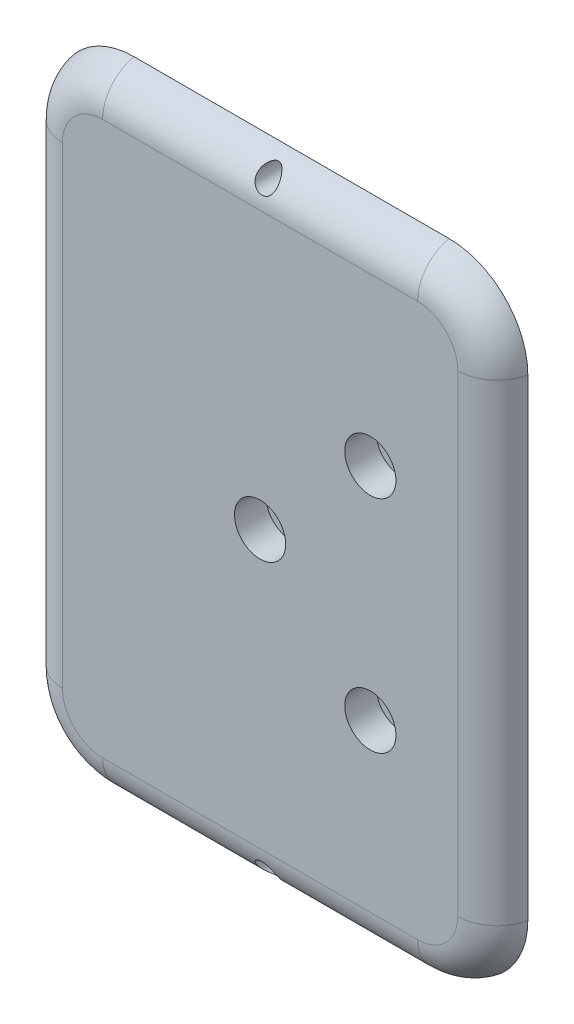
ISO-10303-21;
HEADER;
FILE_DESCRIPTION(('STEP AP214'),'2;1');
FILE_NAME('part.step','',(''),(''),'','','');
FILE_SCHEMA(('AUTOMOTIVE_DESIGN { 1 0 10303 214 1 1 1 1 }'));
ENDSEC;
DATA;
#1=APPLICATION_CONTEXT('core data for automotive mechanical design processes');
#2=APPLICATION_PROTOCOL_DEFINITION('international standard','automotive_design',2000,#1);
#3=PRODUCT_CONTEXT('',#1,'mechanical');
#4=PRODUCT('Part','Part','',(#3));
#5=PRODUCT_RELATED_PRODUCT_CATEGORY('part','',(#4));
#6=PRODUCT_DEFINITION_FORMATION('','',#4);
#7=PRODUCT_DEFINITION_CONTEXT('part definition',#1,'design');
#8=PRODUCT_DEFINITION('design','',#6,#7);
#9=PRODUCT_DEFINITION_SHAPE('','',#8);
#10=(LENGTH_UNIT() NAMED_UNIT(*) SI_UNIT(.MILLI.,.METRE.));
#11=(NAMED_UNIT(*) PLANE_ANGLE_UNIT() SI_UNIT($,.RADIAN.));
#12=(NAMED_UNIT(*) SI_UNIT($,.STERADIAN.) SOLID_ANGLE_UNIT());
#13=UNCERTAINTY_MEASURE_WITH_UNIT(LENGTH_MEASURE(1.E-05),#10,'distance_accuracy_value','');
#14=(GEOMETRIC_REPRESENTATION_CONTEXT(3) GLOBAL_UNCERTAINTY_ASSIGNED_CONTEXT((#13)) GLOBAL_UNIT_ASSIGNED_CONTEXT((#10,
#11,#12)) REPRESENTATION_CONTEXT('',''));
#15=CARTESIAN_POINT('',(0.,0.,0.));
#16=DIRECTION('',(0.,0.,1.));
#17=DIRECTION('',(1.,0.,0.));
#18=AXIS2_PLACEMENT_3D('',#15,#16,#17);
#19=CARTESIAN_POINT('',(20.,-30.,3.));
#20=DIRECTION('',(0.,0.,-1.));
#21=DIRECTION('',(-1.,0.,0.));
#22=AXIS2_PLACEMENT_3D('',#19,#20,#21);
#23=CYLINDRICAL_SURFACE('',#22,5.7);
#24=CARTESIAN_POINT('',(20.,-30.,0.));
#25=DIRECTION('',(0.,0.,1.));
#26=DIRECTION('',(1.,0.,0.));
#27=AXIS2_PLACEMENT_3D('',#24,#25,#26);
#28=CIRCLE('',#27,5.7);
#29=CARTESIAN_POINT('',(20.,-35.7,0.));
#30=VERTEX_POINT('',#29);
#31=CARTESIAN_POINT('',(25.7,-30.,0.));
#32=VERTEX_POINT('',#31);
#33=EDGE_CURVE('E307',#30,#32,#28,.T.);
#34=ORIENTED_EDGE('',*,*,#33,.T.);
#35=DIRECTION('',(0.,0.,-1.));
#36=VECTOR('',#35,1.);
#37=CARTESIAN_POINT('',(25.7,-30.,3.));
#38=LINE('',#37,#36);
#39=CARTESIAN_POINT('',(25.7,-30.,3.));
#40=VERTEX_POINT('',#39);
#41=EDGE_CURVE('E267',#40,#32,#38,.T.);
#42=ORIENTED_EDGE('',*,*,#41,.F.);
#43=CARTESIAN_POINT('',(20.,-30.,3.));
#44=DIRECTION('',(0.,0.,1.));
#45=DIRECTION('',(1.,0.,0.));
#46=AXIS2_PLACEMENT_3D('',#43,#44,#45);
#47=CIRCLE('',#46,5.7);
#48=CARTESIAN_POINT('',(20.,-35.7,3.));
#49=VERTEX_POINT('',#48);
#50=EDGE_CURVE('E294',#49,#40,#47,.T.);
#51=ORIENTED_EDGE('',*,*,#50,.F.);
#52=DIRECTION('',(0.,0.,-1.));
#53=VECTOR('',#52,1.);
#54=CARTESIAN_POINT('',(20.,-35.7,3.));
#55=LINE('',#54,#53);
#56=EDGE_CURVE('E288',#49,#30,#55,.T.);
#57=ORIENTED_EDGE('',*,*,#56,.T.);
#58=EDGE_LOOP('',(#34,#42,#51,#57));
#59=FACE_BOUND('',#58,.T.);
#60=ADVANCED_FACE('F37',(#59),#23,.T.);
#61=CARTESIAN_POINT('',(25.7,-30.,3.));
#62=DIRECTION('',(-1.,0.,0.));
#63=DIRECTION('',(0.,0.,1.));
#64=AXIS2_PLACEMENT_3D('',#61,#62,#63);
#65=PLANE('',#64);
#66=DIRECTION('',(0.,1.,0.));
#67=VECTOR('',#66,1.);
#68=CARTESIAN_POINT('',(25.7,-30.,0.));
#69=LINE('',#68,#67);
#70=CARTESIAN_POINT('',(25.7,30.,0.));
#71=VERTEX_POINT('',#70);
#72=EDGE_CURVE('E305',#32,#71,#69,.T.);
#73=ORIENTED_EDGE('',*,*,#72,.T.);
#74=DIRECTION('',(0.,0.,-1.));
#75=VECTOR('',#74,1.);
#76=CARTESIAN_POINT('',(25.7,30.,3.));
#77=LINE('',#76,#75);
#78=CARTESIAN_POINT('',(25.7,30.,3.));
#79=VERTEX_POINT('',#78);
#80=EDGE_CURVE('E270',#79,#71,#77,.T.);
#81=ORIENTED_EDGE('',*,*,#80,.F.);
#82=DIRECTION('',(0.,1.,0.));
#83=VECTOR('',#82,1.);
#84=CARTESIAN_POINT('',(25.7,-30.,3.));
#85=LINE('',#84,#83);
#86=EDGE_CURVE('E327',#40,#79,#85,.T.);
#87=ORIENTED_EDGE('',*,*,#86,.F.);
#88=ORIENTED_EDGE('',*,*,#41,.T.);
#89=EDGE_LOOP('',(#73,#81,#87,#88));
#90=FACE_BOUND('',#89,.T.);
#91=ADVANCED_FACE('F221',(#90),#65,.F.);
#92=CARTESIAN_POINT('',(20.,30.,3.));
#93=DIRECTION('',(0.,0.,-1.));
#94=DIRECTION('',(-1.,0.,0.));
#95=AXIS2_PLACEMENT_3D('',#92,#93,#94);
#96=CYLINDRICAL_SURFACE('',#95,5.7);
#97=CARTESIAN_POINT('',(20.,30.,0.));
#98=DIRECTION('',(0.,0.,1.));
#99=DIRECTION('',(1.,0.,0.));
#100=AXIS2_PLACEMENT_3D('',#97,#98,#99);
#101=CIRCLE('',#100,5.7);
#102=CARTESIAN_POINT('',(20.,35.7,0.));
#103=VERTEX_POINT('',#102);
#104=EDGE_CURVE('E303',#71,#103,#101,.T.);
#105=ORIENTED_EDGE('',*,*,#104,.T.);
#106=DIRECTION('',(0.,0.,-1.));
#107=VECTOR('',#106,1.);
#108=CARTESIAN_POINT('',(20.,35.7,3.));
#109=LINE('',#108,#107);
#110=CARTESIAN_POINT('',(20.,35.7,3.));
#111=VERTEX_POINT('',#110);
#112=EDGE_CURVE('E273',#111,#103,#109,.T.);
#113=ORIENTED_EDGE('',*,*,#112,.F.);
#114=CARTESIAN_POINT('',(20.,30.,3.));
#115=DIRECTION('',(0.,0.,1.));
#116=DIRECTION('',(1.,0.,0.));
#117=AXIS2_PLACEMENT_3D('',#114,#115,#116);
#118=CIRCLE('',#117,5.7);
#119=EDGE_CURVE('E324',#79,#111,#118,.T.);
#120=ORIENTED_EDGE('',*,*,#119,.F.);
#121=ORIENTED_EDGE('',*,*,#80,.T.);
#122=EDGE_LOOP('',(#105,#113,#120,#121));
#123=FACE_BOUND('',#122,.T.);
#124=ADVANCED_FACE('F227',(#123),#96,.T.);
#125=CARTESIAN_POINT('',(20.,35.7,3.));
#126=DIRECTION('',(0.,-1.,0.));
#127=DIRECTION('',(0.,0.,-1.));
#128=AXIS2_PLACEMENT_3D('',#125,#126,#127);
#129=PLANE('',#128);
#130=DIRECTION('',(-1.,0.,0.));
#131=VECTOR('',#130,1.);
#132=CARTESIAN_POINT('',(20.,35.7,0.));
#133=LINE('',#132,#131);
#134=CARTESIAN_POINT('',(-20.,35.7,0.));
#135=VERTEX_POINT('',#134);
#136=EDGE_CURVE('E301',#103,#135,#133,.T.);
#137=ORIENTED_EDGE('',*,*,#136,.T.);
#138=DIRECTION('',(0.,0.,-1.));
#139=VECTOR('',#138,1.);
#140=CARTESIAN_POINT('',(-20.,35.7,3.));
#141=LINE('',#140,#139);
#142=CARTESIAN_POINT('',(-20.,35.7,3.));
#143=VERTEX_POINT('',#142);
#144=EDGE_CURVE('E276',#143,#135,#141,.T.);
#145=ORIENTED_EDGE('',*,*,#144,.F.);
#146=DIRECTION('',(-1.,0.,0.));
#147=VECTOR('',#146,1.);
#148=CARTESIAN_POINT('',(20.,35.7,3.));
#149=LINE('',#148,#147);
#150=EDGE_CURVE('E321',#111,#143,#149,.T.);
#151=ORIENTED_EDGE('',*,*,#150,.F.);
#152=ORIENTED_EDGE('',*,*,#112,.T.);
#153=EDGE_LOOP('',(#137,#145,#151,#152));
#154=FACE_BOUND('',#153,.T.);
#155=ADVANCED_FACE('F406',(#154),#129,.F.);
#156=CARTESIAN_POINT('',(-20.,30.,3.));
#157=DIRECTION('',(0.,0.,-1.));
#158=DIRECTION('',(-1.,0.,0.));
#159=AXIS2_PLACEMENT_3D('',#156,#157,#158);
#160=CYLINDRICAL_SURFACE('',#159,5.7);
#161=CARTESIAN_POINT('',(-20.,30.,0.));
#162=DIRECTION('',(0.,0.,1.));
#163=DIRECTION('',(1.,0.,0.));
#164=AXIS2_PLACEMENT_3D('',#161,#162,#163);
#165=CIRCLE('',#164,5.7);
#166=CARTESIAN_POINT('',(-25.7,30.,0.));
#167=VERTEX_POINT('',#166);
#168=EDGE_CURVE('E299',#135,#167,#165,.T.);
#169=ORIENTED_EDGE('',*,*,#168,.T.);
#170=DIRECTION('',(0.,0.,-1.));
#171=VECTOR('',#170,1.);
#172=CARTESIAN_POINT('',(-25.7,30.,3.));
#173=LINE('',#172,#171);
#174=CARTESIAN_POINT('',(-25.7,30.,3.));
#175=VERTEX_POINT('',#174);
#176=EDGE_CURVE('E279',#175,#167,#173,.T.);
#177=ORIENTED_EDGE('',*,*,#176,.F.);
#178=CARTESIAN_POINT('',(-20.,30.,3.));
#179=DIRECTION('',(0.,0.,1.));
#180=DIRECTION('',(1.,0.,0.));
#181=AXIS2_PLACEMENT_3D('',#178,#179,#180);
#182=CIRCLE('',#181,5.7);
#183=EDGE_CURVE('E318',#143,#175,#182,.T.);
#184=ORIENTED_EDGE('',*,*,#183,.F.);
#185=ORIENTED_EDGE('',*,*,#144,.T.);
#186=EDGE_LOOP('',(#169,#177,#184,#185));
#187=FACE_BOUND('',#186,.T.);
#188=ADVANCED_FACE('F402',(#187),#160,.T.);
#189=CARTESIAN_POINT('',(-25.7,30.,3.));
#190=DIRECTION('',(1.,0.,0.));
#191=DIRECTION('',(0.,0.,-1.));
#192=AXIS2_PLACEMENT_3D('',#189,#190,#191);
#193=PLANE('',#192);
#194=DIRECTION('',(0.,-1.,0.));
#195=VECTOR('',#194,1.);
#196=CARTESIAN_POINT('',(-25.7,30.,0.));
#197=LINE('',#196,#195);
#198=CARTESIAN_POINT('',(-25.7,-30.,0.));
#199=VERTEX_POINT('',#198);
#200=EDGE_CURVE('E297',#167,#199,#197,.T.);
#201=ORIENTED_EDGE('',*,*,#200,.T.);
#202=DIRECTION('',(0.,0.,-1.));
#203=VECTOR('',#202,1.);
#204=CARTESIAN_POINT('',(-25.7,-30.,3.));
#205=LINE('',#204,#203);
#206=CARTESIAN_POINT('',(-25.7,-30.,3.));
#207=VERTEX_POINT('',#206);
#208=EDGE_CURVE('E282',#207,#199,#205,.T.);
#209=ORIENTED_EDGE('',*,*,#208,.F.);
#210=DIRECTION('',(0.,-1.,0.));
#211=VECTOR('',#210,1.);
#212=CARTESIAN_POINT('',(-25.7,30.,3.));
#213=LINE('',#212,#211);
#214=EDGE_CURVE('E315',#175,#207,#213,.T.);
#215=ORIENTED_EDGE('',*,*,#214,.F.);
#216=ORIENTED_EDGE('',*,*,#176,.T.);
#217=EDGE_LOOP('',(#201,#209,#215,#216));
#218=FACE_BOUND('',#217,.T.);
#219=ADVANCED_FACE('F398',(#218),#193,.F.);
#220=CARTESIAN_POINT('',(-20.,-30.,3.));
#221=DIRECTION('',(0.,0.,-1.));
#222=DIRECTION('',(-1.,0.,0.));
#223=AXIS2_PLACEMENT_3D('',#220,#221,#222);
#224=CYLINDRICAL_SURFACE('',#223,5.7);
#225=CARTESIAN_POINT('',(-20.,-30.,0.));
#226=DIRECTION('',(0.,0.,1.));
#227=DIRECTION('',(1.,0.,0.));
#228=AXIS2_PLACEMENT_3D('',#225,#226,#227);
#229=CIRCLE('',#228,5.7);
#230=CARTESIAN_POINT('',(-20.,-35.7,0.));
#231=VERTEX_POINT('',#230);
#232=EDGE_CURVE('E295',#199,#231,#229,.T.);
#233=ORIENTED_EDGE('',*,*,#232,.T.);
#234=DIRECTION('',(0.,0.,-1.));
#235=VECTOR('',#234,1.);
#236=CARTESIAN_POINT('',(-20.,-35.7,3.));
#237=LINE('',#236,#235);
#238=CARTESIAN_POINT('',(-20.,-35.7,3.));
#239=VERTEX_POINT('',#238);
#240=EDGE_CURVE('E285',#239,#231,#237,.T.);
#241=ORIENTED_EDGE('',*,*,#240,.F.);
#242=CARTESIAN_POINT('',(-20.,-30.,3.));
#243=DIRECTION('',(0.,0.,1.));
#244=DIRECTION('',(1.,0.,0.));
#245=AXIS2_PLACEMENT_3D('',#242,#243,#244);
#246=CIRCLE('',#245,5.7);
#247=EDGE_CURVE('E312',#207,#239,#246,.T.);
#248=ORIENTED_EDGE('',*,*,#247,.F.);
#249=ORIENTED_EDGE('',*,*,#208,.T.);
#250=EDGE_LOOP('',(#233,#241,#248,#249));
#251=FACE_BOUND('',#250,.T.);
#252=ADVANCED_FACE('F394',(#251),#224,.T.);
#253=CARTESIAN_POINT('',(-20.,-35.7,3.));
#254=DIRECTION('',(0.,1.,0.));
#255=DIRECTION('',(0.,0.,1.));
#256=AXIS2_PLACEMENT_3D('',#253,#254,#255);
#257=PLANE('',#256);
#258=DIRECTION('',(1.,0.,0.));
#259=VECTOR('',#258,1.);
#260=CARTESIAN_POINT('',(-20.,-35.7,0.));
#261=LINE('',#260,#259);
#262=EDGE_CURVE('E292',#231,#30,#261,.T.);
#263=ORIENTED_EDGE('',*,*,#262,.T.);
#264=ORIENTED_EDGE('',*,*,#56,.F.);
#265=DIRECTION('',(1.,0.,0.));
#266=VECTOR('',#265,1.);
#267=CARTESIAN_POINT('',(-20.,-35.7,3.));
#268=LINE('',#267,#266);
#269=EDGE_CURVE('E291',#239,#49,#268,.T.);
#270=ORIENTED_EDGE('',*,*,#269,.F.);
#271=ORIENTED_EDGE('',*,*,#240,.T.);
#272=EDGE_LOOP('',(#263,#264,#270,#271));
#273=FACE_BOUND('',#272,.T.);
#274=ADVANCED_FACE('F390',(#273),#257,.F.);
#275=CARTESIAN_POINT('',(20.,-30.,0.));
#276=DIRECTION('',(0.,0.,1.));
#277=DIRECTION('',(1.,0.,0.));
#278=AXIS2_PLACEMENT_3D('',#275,#276,#277);
#279=PLANE('',#278);
#280=ORIENTED_EDGE('',*,*,#33,.F.);
#281=ORIENTED_EDGE('',*,*,#262,.F.);
#282=ORIENTED_EDGE('',*,*,#232,.F.);
#283=ORIENTED_EDGE('',*,*,#200,.F.);
#284=ORIENTED_EDGE('',*,*,#168,.F.);
#285=ORIENTED_EDGE('',*,*,#136,.F.);
#286=ORIENTED_EDGE('',*,*,#104,.F.);
#287=ORIENTED_EDGE('',*,*,#72,.F.);
#288=EDGE_LOOP('',(#280,#281,#282,#283,#284,#285,#286,#287));
#289=FACE_BOUND('',#288,.T.);
#290=ADVANCED_FACE('F378',(#289),#279,.F.);
#291=CARTESIAN_POINT('',(20.,-30.,3.));
#292=DIRECTION('',(0.,0.,1.));
#293=DIRECTION('',(1.,0.,0.));
#294=AXIS2_PLACEMENT_3D('',#291,#292,#293);
#295=PLANE('',#294);
#296=CARTESIAN_POINT('',(0.,-38.,3.));
#297=DIRECTION('',(0.,0.,1.));
#298=DIRECTION('',(1.,0.,0.));
#299=AXIS2_PLACEMENT_3D('',#296,#297,#298);
#300=CIRCLE('',#299,1.35);
#301=CARTESIAN_POINT('',(1.35,-38.,3.));
#302=VERTEX_POINT('',#301);
#303=EDGE_CURVE('E346',#302,#302,#300,.T.);
#304=ORIENTED_EDGE('',*,*,#303,.T.);
#305=EDGE_LOOP('',(#304));
#306=FACE_BOUND('',#305,.T.);
#307=CARTESIAN_POINT('',(0.,38.,3.));
#308=DIRECTION('',(0.,0.,1.));
#309=DIRECTION('',(1.,0.,0.));
#310=AXIS2_PLACEMENT_3D('',#307,#308,#309);
#311=CIRCLE('',#310,1.35);
#312=CARTESIAN_POINT('',(1.35,38.,3.));
#313=VERTEX_POINT('',#312);
#314=EDGE_CURVE('E201',#313,#313,#311,.T.);
#315=ORIENTED_EDGE('',*,*,#314,.T.);
#316=EDGE_LOOP('',(#315));
#317=FACE_BOUND('',#316,.T.);
#318=CARTESIAN_POINT('',(20.,-30.,3.));
#319=DIRECTION('',(0.,0.,1.));
#320=DIRECTION('',(1.,0.,0.));
#321=AXIS2_PLACEMENT_3D('',#318,#319,#320);
#322=CIRCLE('',#321,10.);
#323=CARTESIAN_POINT('',(20.,-40.,3.));
#324=VERTEX_POINT('',#323);
#325=CARTESIAN_POINT('',(30.,-30.,3.));
#326=VERTEX_POINT('',#325);
#327=EDGE_CURVE('E160',#324,#326,#322,.T.);
#328=ORIENTED_EDGE('',*,*,#327,.F.);
#329=DIRECTION('',(1.,0.,0.));
#330=VECTOR('',#329,1.);
#331=CARTESIAN_POINT('',(-20.,-40.,3.));
#332=LINE('',#331,#330);
#333=CARTESIAN_POINT('',(-20.,-40.,3.));
#334=VERTEX_POINT('',#333);
#335=EDGE_CURVE('E309',#334,#324,#332,.T.);
#336=ORIENTED_EDGE('',*,*,#335,.F.);
#337=CARTESIAN_POINT('',(-20.,-30.,3.));
#338=DIRECTION('',(0.,0.,1.));
#339=DIRECTION('',(1.,0.,0.));
#340=AXIS2_PLACEMENT_3D('',#337,#338,#339);
#341=CIRCLE('',#340,10.);
#342=CARTESIAN_POINT('',(-30.,-30.,3.));
#343=VERTEX_POINT('',#342);
#344=EDGE_CURVE('E333',#343,#334,#341,.T.);
#345=ORIENTED_EDGE('',*,*,#344,.F.);
#346=DIRECTION('',(0.,-1.,0.));
#347=VECTOR('',#346,1.);
#348=CARTESIAN_POINT('',(-30.,30.,3.));
#349=LINE('',#348,#347);
#350=CARTESIAN_POINT('',(-30.,30.,3.));
#351=VERTEX_POINT('',#350);
#352=EDGE_CURVE('E336',#351,#343,#349,.T.);
#353=ORIENTED_EDGE('',*,*,#352,.F.);
#354=CARTESIAN_POINT('',(-20.,30.,3.));
#355=DIRECTION('',(0.,0.,1.));
#356=DIRECTION('',(1.,0.,0.));
#357=AXIS2_PLACEMENT_3D('',#354,#355,#356);
#358=CIRCLE('',#357,10.);
#359=CARTESIAN_POINT('',(-20.,40.,3.));
#360=VERTEX_POINT('',#359);
#361=EDGE_CURVE('E339',#360,#351,#358,.T.);
#362=ORIENTED_EDGE('',*,*,#361,.F.);
#363=DIRECTION('',(-1.,0.,0.));
#364=VECTOR('',#363,1.);
#365=CARTESIAN_POINT('',(20.,40.,3.));
#366=LINE('',#365,#364);
#367=CARTESIAN_POINT('',(20.,40.,3.));
#368=VERTEX_POINT('',#367);
#369=EDGE_CURVE('E252',#368,#360,#366,.T.);
#370=ORIENTED_EDGE('',*,*,#369,.F.);
#371=CARTESIAN_POINT('',(20.,30.,3.));
#372=DIRECTION('',(0.,0.,1.));
#373=DIRECTION('',(1.,0.,0.));
#374=AXIS2_PLACEMENT_3D('',#371,#372,#373);
#375=CIRCLE('',#374,10.);
#376=CARTESIAN_POINT('',(30.,30.,3.));
#377=VERTEX_POINT('',#376);
#378=EDGE_CURVE('E162',#377,#368,#375,.T.);
#379=ORIENTED_EDGE('',*,*,#378,.F.);
#380=DIRECTION('',(0.,1.,0.));
#381=VECTOR('',#380,1.);
#382=CARTESIAN_POINT('',(30.,-30.,3.));
#383=LINE('',#382,#381);
#384=EDGE_CURVE('E157',#326,#377,#383,.T.);
#385=ORIENTED_EDGE('',*,*,#384,.F.);
#386=EDGE_LOOP('',(#328,#336,#345,#353,#362,#370,#379,#385));
#387=FACE_BOUND('',#386,.T.);
#388=ORIENTED_EDGE('',*,*,#269,.T.);
#389=ORIENTED_EDGE('',*,*,#50,.T.);
#390=ORIENTED_EDGE('',*,*,#86,.T.);
#391=ORIENTED_EDGE('',*,*,#119,.T.);
#392=ORIENTED_EDGE('',*,*,#150,.T.);
#393=ORIENTED_EDGE('',*,*,#183,.T.);
#394=ORIENTED_EDGE('',*,*,#214,.T.);
#395=ORIENTED_EDGE('',*,*,#247,.T.);
#396=EDGE_LOOP('',(#388,#389,#390,#391,#392,#393,#394,#395));
#397=FACE_BOUND('',#396,.T.);
#398=ADVANCED_FACE('F158',(#306,#317,#387,#397),#295,.F.);
#399=CARTESIAN_POINT('',(20.,-30.,7.));
#400=DIRECTION('',(0.,0.,1.));
#401=DIRECTION('',(1.,0.,0.));
#402=AXIS2_PLACEMENT_3D('',#399,#400,#401);
#403=PLANE('',#402);
#404=DIRECTION('',(-1.,0.,0.));
#405=VECTOR('',#404,1.);
#406=CARTESIAN_POINT('',(20.,-35.1010205144336,7.));
#407=LINE('',#406,#405);
#408=CARTESIAN_POINT('',(-20.,-35.1010205144336,7.));
#409=VERTEX_POINT('',#408);
#410=CARTESIAN_POINT('',(20.,-35.1010205144336,7.));
#411=VERTEX_POINT('',#410);
#412=EDGE_CURVE('E265',#409,#411,#407,.F.);
#413=ORIENTED_EDGE('',*,*,#412,.T.);
#414=CARTESIAN_POINT('',(20.,-30.,7.));
#415=DIRECTION('',(0.,0.,1.));
#416=DIRECTION('',(1.,0.,0.));
#417=AXIS2_PLACEMENT_3D('',#414,#415,#416);
#418=CIRCLE('',#417,5.10102051443364);
#419=CARTESIAN_POINT('',(25.1010205144336,-30.,7.));
#420=VERTEX_POINT('',#419);
#421=EDGE_CURVE('E11',#411,#420,#418,.T.);
#422=ORIENTED_EDGE('',*,*,#421,.T.);
#423=DIRECTION('',(0.,-1.,0.));
#424=VECTOR('',#423,1.);
#425=CARTESIAN_POINT('',(25.1010205144336,30.,7.));
#426=LINE('',#425,#424);
#427=CARTESIAN_POINT('',(25.1010205144336,30.,7.));
#428=VERTEX_POINT('',#427);
#429=EDGE_CURVE('E51',#420,#428,#426,.F.);
#430=ORIENTED_EDGE('',*,*,#429,.T.);
#431=CARTESIAN_POINT('',(20.,30.,7.));
#432=DIRECTION('',(0.,0.,1.));
#433=DIRECTION('',(1.,0.,0.));
#434=AXIS2_PLACEMENT_3D('',#431,#432,#433);
#435=CIRCLE('',#434,5.10102051443364);
#436=CARTESIAN_POINT('',(20.,35.1010205144336,7.));
#437=VERTEX_POINT('',#436);
#438=EDGE_CURVE('E248',#428,#437,#435,.T.);
#439=ORIENTED_EDGE('',*,*,#438,.T.);
#440=DIRECTION('',(1.,0.,0.));
#441=VECTOR('',#440,1.);
#442=CARTESIAN_POINT('',(-20.,35.1010205144336,7.));
#443=LINE('',#442,#441);
#444=CARTESIAN_POINT('',(-20.,35.1010205144336,7.));
#445=VERTEX_POINT('',#444);
#446=EDGE_CURVE('E253',#437,#445,#443,.F.);
#447=ORIENTED_EDGE('',*,*,#446,.T.);
#448=CARTESIAN_POINT('',(-20.,30.,7.));
#449=DIRECTION('',(0.,0.,1.));
#450=DIRECTION('',(1.,0.,0.));
#451=AXIS2_PLACEMENT_3D('',#448,#449,#450);
#452=CIRCLE('',#451,5.10102051443364);
#453=CARTESIAN_POINT('',(-25.1010205144336,30.,7.));
#454=VERTEX_POINT('',#453);
#455=EDGE_CURVE('E256',#445,#454,#452,.T.);
#456=ORIENTED_EDGE('',*,*,#455,.T.);
#457=DIRECTION('',(0.,1.,0.));
#458=VECTOR('',#457,1.);
#459=CARTESIAN_POINT('',(-25.1010205144336,-30.,7.));
#460=LINE('',#459,#458);
#461=CARTESIAN_POINT('',(-25.1010205144336,-30.,7.));
#462=VERTEX_POINT('',#461);
#463=EDGE_CURVE('E259',#454,#462,#460,.F.);
#464=ORIENTED_EDGE('',*,*,#463,.T.);
#465=CARTESIAN_POINT('',(-20.,-30.,7.));
#466=DIRECTION('',(0.,0.,1.));
#467=DIRECTION('',(1.,0.,0.));
#468=AXIS2_PLACEMENT_3D('',#465,#466,#467);
#469=CIRCLE('',#468,5.10102051443364);
#470=EDGE_CURVE('E263',#462,#409,#469,.T.);
#471=ORIENTED_EDGE('',*,*,#470,.T.);
#472=EDGE_LOOP('',(#413,#422,#430,#439,#447,#456,#464,#471));
#473=FACE_BOUND('',#472,.T.);
#474=CARTESIAN_POINT('',(14.,-14.,7.));
#475=DIRECTION('',(0.,0.,1.));
#476=DIRECTION('',(1.,0.,0.));
#477=AXIS2_PLACEMENT_3D('',#474,#475,#476);
#478=CIRCLE('',#477,3.25);
#479=CARTESIAN_POINT('',(17.25,-14.,7.));
#480=VERTEX_POINT('',#479);
#481=EDGE_CURVE('E353',#480,#480,#478,.T.);
#482=ORIENTED_EDGE('',*,*,#481,.F.);
#483=EDGE_LOOP('',(#482));
#484=FACE_BOUND('',#483,.T.);
#485=CARTESIAN_POINT('',(0.,0.,7.));
#486=DIRECTION('',(0.,0.,1.));
#487=DIRECTION('',(1.,0.,0.));
#488=AXIS2_PLACEMENT_3D('',#485,#486,#487);
#489=CIRCLE('',#488,3.25);
#490=CARTESIAN_POINT('',(3.25,0.,7.));
#491=VERTEX_POINT('',#490);
#492=EDGE_CURVE('E349',#491,#491,#489,.T.);
#493=ORIENTED_EDGE('',*,*,#492,.F.);
#494=EDGE_LOOP('',(#493));
#495=FACE_BOUND('',#494,.T.);
#496=CARTESIAN_POINT('',(14.,14.,7.));
#497=DIRECTION('',(0.,0.,1.));
#498=DIRECTION('',(1.,0.,0.));
#499=AXIS2_PLACEMENT_3D('',#496,#497,#498);
#500=CIRCLE('',#499,3.25);
#501=CARTESIAN_POINT('',(17.25,14.,7.));
#502=VERTEX_POINT('',#501);
#503=EDGE_CURVE('E359',#502,#502,#500,.T.);
#504=ORIENTED_EDGE('',*,*,#503,.F.);
#505=EDGE_LOOP('',(#504));
#506=FACE_BOUND('',#505,.T.);
#507=ADVANCED_FACE('F370',(#473,#484,#495,#506),#403,.T.);
#508=CARTESIAN_POINT('',(0.,38.,7.));
#509=DIRECTION('',(0.,0.,-1.));
#510=DIRECTION('',(-1.,0.,0.));
#511=AXIS2_PLACEMENT_3D('',#508,#509,#510);
#512=CYLINDRICAL_SURFACE('',#511,1.35);
#513=CARTESIAN_POINT('',(-1.29522446520432,37.6193511004401,6.31949199091565));
#514=CARTESIAN_POINT('',(-1.27516240720157,37.5510832451305,6.35929614797901));
#515=CARTESIAN_POINT('',(-1.24931581611246,37.4831279398367,6.39672651435616));
#516=CARTESIAN_POINT('',(-1.18558189552019,37.350135953817,6.46621739748809));
#517=CARTESIAN_POINT('',(-1.14769843408164,37.2850983431375,6.49827963425153));
#518=CARTESIAN_POINT('',(-1.05986479208526,37.1603391140759,6.55675139432912));
#519=CARTESIAN_POINT('',(-1.00986131098131,37.1006426176664,6.58313494898185));
#520=CARTESIAN_POINT('',(-0.898863133370254,36.9897053203178,6.62995733190877));
#521=CARTESIAN_POINT('',(-0.837870650666671,36.9384628202438,6.65039735538074));
#522=CARTESIAN_POINT('',(-0.711602889662035,36.850391180654,6.68420410600012));
#523=CARTESIAN_POINT('',(-0.646989131220278,36.8127706702154,6.69798552641682));
#524=CARTESIAN_POINT('',(-0.511754551698244,36.7485179735808,6.7209027025419));
#525=CARTESIAN_POINT('',(-0.441135035694699,36.7218834074142,6.73003946455858));
#526=CARTESIAN_POINT('',(-0.298838530886498,36.6814943253592,6.743684397527));
#527=CARTESIAN_POINT('',(-0.227305744225878,36.6672853893954,6.74835650762605));
#528=CARTESIAN_POINT('',(-0.0827417709320308,36.6505754384922,6.7538362386546));
#529=CARTESIAN_POINT('',(-0.00971070688096597,36.648073469549,6.75464417447676));
#530=CARTESIAN_POINT('',(0.135142300145605,36.6548415746181,6.75243636390875));
#531=CARTESIAN_POINT('',(0.206969247225923,36.6640153642579,6.74945189200354));
#532=CARTESIAN_POINT('',(0.347982220228228,36.6936317318273,6.73960234731665));
#533=CARTESIAN_POINT('',(0.417168343309653,36.7140738947504,6.73273741744939));
#534=CARTESIAN_POINT('',(0.550996214623903,36.7654782501737,6.71490360443646));
#535=CARTESIAN_POINT('',(0.615635225654242,36.7964467148298,6.70393227407385));
#536=CARTESIAN_POINT('',(0.738560121522502,36.8677119032095,6.67763165802022));
#537=CARTESIAN_POINT('',(0.796846253883259,36.9080082633055,6.66230254220263));
#538=CARTESIAN_POINT('',(0.906209756254323,36.9968543168198,6.626890784648));
#539=CARTESIAN_POINT('',(0.957201453913253,37.0454893334025,6.60675806117498));
#540=CARTESIAN_POINT('',(1.05014549324573,37.1488090758019,6.5617685935246));
#541=CARTESIAN_POINT('',(1.0920969102451,37.2034944196042,6.53691136659603));
#542=CARTESIAN_POINT('',(1.16796466281368,37.3193022124394,6.48146306323529));
#543=CARTESIAN_POINT('',(1.20147057297632,37.3805983869247,6.45067534486786));
#544=CARTESIAN_POINT('',(1.25802557845958,37.5054542680513,6.38448368549581));
#545=CARTESIAN_POINT('',(1.28107100621283,37.5690147601781,6.34907813101626));
#546=CARTESIAN_POINT('',(1.31894162383654,37.7029886080163,6.27040770406358));
#547=CARTESIAN_POINT('',(1.3327026629124,37.7734462703934,6.22671027765358));
#548=CARTESIAN_POINT('',(1.34902311063828,37.9129506590693,6.13521775196539));
#549=CARTESIAN_POINT('',(1.35157700168361,37.9819966737269,6.08742064609929));
#550=CARTESIAN_POINT('',(1.34617252757019,38.1288174861658,5.98020594245517));
#551=CARTESIAN_POINT('',(1.33635727486084,38.2060859267631,5.92019257427501));
#552=CARTESIAN_POINT('',(1.30459454934032,38.355495303173,5.79707692165359));
#553=CARTESIAN_POINT('',(1.28263705015766,38.4276319458064,5.73397212378802));
#554=CARTESIAN_POINT('',(1.22217861290273,38.580406927651,5.59260796089799));
#555=CARTESIAN_POINT('',(1.18118073846528,38.6596755740125,5.51393546471245));
#556=CARTESIAN_POINT('',(1.08464123795382,38.8086741101216,5.35634535257337));
#557=CARTESIAN_POINT('',(1.02908986604609,38.8783975600551,5.27742760751372));
#558=CARTESIAN_POINT('',(0.917176282042229,38.9930836900514,5.13974983021374));
#559=CARTESIAN_POINT('',(0.863681614065511,39.0401190136815,5.08037499278458));
#560=CARTESIAN_POINT('',(0.746920976954941,39.1268972023269,4.9660429954202));
#561=CARTESIAN_POINT('',(0.683676336737031,39.1666555806952,4.91107658142047));
#562=CARTESIAN_POINT('',(0.572704166741172,39.2234120932318,4.82972173890465));
#563=CARTESIAN_POINT('',(0.528500035881776,39.2432502748685,4.80052954912952));
#564=CARTESIAN_POINT('',(0.435541076896274,39.2787776300071,4.74724643892362));
#565=CARTESIAN_POINT('',(0.386793292297627,39.2944730854061,4.72314780597172));
#566=CARTESIAN_POINT('',(0.295946890544962,39.3178050702222,4.68683701837886));
#567=CARTESIAN_POINT('',(0.254696384953901,39.3264509142203,4.67318072445476));
#568=CARTESIAN_POINT('',(0.170095107417013,39.3399234418324,4.65176634874328));
#569=CARTESIAN_POINT('',(0.126747432794497,39.3447555855673,4.64399983511198));
#570=CARTESIAN_POINT('',(0.0388028791141914,39.3501642876776,4.63530021136794));
#571=CARTESIAN_POINT('',(-0.00580012964876353,39.3507139655154,4.6344102649485));
#572=CARTESIAN_POINT('',(-0.0944229645708572,39.347425270317,4.63970722094295));
#573=CARTESIAN_POINT('',(-0.13844242033665,39.3435842337546,4.64589841897184));
#574=CARTESIAN_POINT('',(-0.230077826377712,39.3311540107825,4.66573059176908));
#575=CARTESIAN_POINT('',(-0.277428893641048,39.3220180273085,4.68022676303362));
#576=CARTESIAN_POINT('',(-0.368732897518822,39.2995225464037,4.71532950199926));
#577=CARTESIAN_POINT('',(-0.41267881574451,39.2861546003034,4.73594828770689));
#578=CARTESIAN_POINT('',(-0.520166646992115,39.2476988033274,4.79407103960642));
#579=CARTESIAN_POINT('',(-0.581174742896448,39.2202106783792,4.83462104387383));
#580=CARTESIAN_POINT('',(-0.695330058796834,39.1589773246049,4.92161622384196));
#581=CARTESIAN_POINT('',(-0.748455088178185,39.1252150133262,4.96807738198025));
#582=CARTESIAN_POINT('',(-0.837650495188439,39.0598313681158,5.05452753622045));
#583=CARTESIAN_POINT('',(-0.874998973101194,39.0291531708321,5.09393027152586));
#584=CARTESIAN_POINT('',(-0.945526688104737,38.9647591440385,5.17398340632831));
#585=CARTESIAN_POINT('',(-0.978703641202167,38.9310416676576,5.21463447428866));
#586=CARTESIAN_POINT('',(-1.0722674215056,38.8255868807949,5.33754656937319));
#587=CARTESIAN_POINT('',(-1.12668411003063,38.7495495118785,5.42076338512019));
#588=CARTESIAN_POINT('',(-1.22049140357099,38.5849066866417,5.58842105830694));
#589=CARTESIAN_POINT('',(-1.25942440117249,38.4960116077177,5.67283203940264));
#590=CARTESIAN_POINT('',(-1.31789904154198,38.308602579004,5.83756262277355));
#591=CARTESIAN_POINT('',(-1.33747466987566,38.2101058221207,5.91788915994645));
#592=CARTESIAN_POINT('',(-1.35198549041841,38.0293827727152,6.05394002070011));
#593=CARTESIAN_POINT('',(-1.35153773327557,37.9485975723414,6.1110851033666));
#594=CARTESIAN_POINT('',(-1.33527139661713,37.7848376946513,6.21980187922268));
#595=CARTESIAN_POINT('',(-1.31947336644068,37.7018660887226,6.27138092108954));
#596=CARTESIAN_POINT('',(-1.29522446520432,37.6193511004401,6.31949199091565));
#597=B_SPLINE_CURVE_WITH_KNOTS('',3,(#513,#514,#515,#516,#517,#518,#519,#520,#521,#522,#523,
#524,#525,#526,#527,#528,#529,#530,#531,#532,#533,#534,#535,#536,#537,#538,#539,#540,#541,#542,
#543,#544,#545,#546,#547,#548,#549,#550,#551,#552,#553,#554,#555,#556,#557,#558,#559,#560,#561,
#562,#563,#564,#565,#566,#567,#568,#569,#570,#571,#572,#573,#574,#575,#576,#577,#578,#579,#580,
#581,#582,#583,#584,#585,#586,#587,#588,#589,#590,#591,#592,#593,#594,#595,#596),.UNSPECIFIED.,
.T.,.F.,(4,2,2,2,2,2,2,2,2,2,2,2,2,2,2,2,2,2,2,2,2,2,2,2,2,2,2,2,2,2,2,2,2,2,2,2,2,2,2,2,2,4),
(0.,0.24431534247009,0.488552253143437,0.733883386427069,0.979165151360741,1.20610146181714,
1.4329885834404,1.65118207417944,1.86935778396577,2.08574590632973,2.30212605979728,
2.51863537127257,2.73513624402694,2.95400136387328,3.17288885945918,3.40094973399854,
3.62909050769812,3.88025259395034,4.13153832073395,4.42545421690505,4.71961317517644,
5.07519081175168,5.43100717431223,5.70853727462536,5.98546865018515,6.15476162995182,
6.32379640497669,6.45620316222193,6.58842000546777,6.72146609496427,6.85459293666753,
7.00482954967273,7.1553680061006,7.38879665568848,7.62287041864755,7.80970248865474,
7.99663641159318,8.37051886818674,8.75475023185696,9.13830579972076,9.43400374048648,
9.72930637640109),.UNSPECIFIED.);
#598=CARTESIAN_POINT('',(-1.29522446520432,37.6193511004401,6.31949199091565));
#599=VERTEX_POINT('',#598);
#600=EDGE_CURVE('E171',#599,#599,#597,.T.);
#601=ORIENTED_EDGE('',*,*,#600,.T.);
#602=EDGE_LOOP('',(#601));
#603=FACE_BOUND('',#602,.T.);
#604=ORIENTED_EDGE('',*,*,#314,.F.);
#605=EDGE_LOOP('',(#604));
#606=FACE_BOUND('',#605,.T.);
#607=ADVANCED_FACE('F202',(#603,#606),#512,.F.);
#608=CARTESIAN_POINT('',(0.,-38.,7.));
#609=DIRECTION('',(0.,0.,-1.));
#610=DIRECTION('',(-1.,0.,0.));
#611=AXIS2_PLACEMENT_3D('',#608,#609,#610);
#612=CYLINDRICAL_SURFACE('',#611,1.35);
#613=CARTESIAN_POINT('',(-1.29522446520432,-37.6193511004401,6.31949199091565));
#614=CARTESIAN_POINT('',(-1.32354690633646,-37.7157475648009,6.263281796846));
#615=CARTESIAN_POINT('',(-1.34036083718994,-37.812921800257,6.20223139301221));
#616=CARTESIAN_POINT('',(-1.35341491992491,-38.0038494233178,6.07271911370386));
#617=CARTESIAN_POINT('',(-1.34956535394086,-38.0975861112676,6.00422618551116));
#618=CARTESIAN_POINT('',(-1.32304210307902,-38.2861164433303,5.85625426410678));
#619=CARTESIAN_POINT('',(-1.29881419322803,-38.3803373351411,5.7763357321676));
#620=CARTESIAN_POINT('',(-1.2324341494446,-38.5592273915443,5.61323627622271));
#621=CARTESIAN_POINT('',(-1.19026491250002,-38.6438873442366,5.53005230822013));
#622=CARTESIAN_POINT('',(-1.11447292886349,-38.7633557205016,5.40451539011115));
#623=CARTESIAN_POINT('',(-1.08686682716451,-38.8021838853427,5.36222669008329));
#624=CARTESIAN_POINT('',(-1.02748931059321,-38.8769522386305,5.27803301465667));
#625=CARTESIAN_POINT('',(-0.995719653249144,-38.9128936353778,5.23612788528505));
#626=CARTESIAN_POINT('',(-0.928003496028572,-38.9816483283209,5.15335013548065));
#627=CARTESIAN_POINT('',(-0.892066607578758,-39.0144685169674,5.11247539375951));
#628=CARTESIAN_POINT('',(-0.815737092840137,-39.0768006015208,5.03244772733355));
#629=CARTESIAN_POINT('',(-0.775348420669743,-39.106315387078,4.99329331717027));
#630=CARTESIAN_POINT('',(-0.691546894815283,-39.1604494756899,4.91942464528004));
#631=CARTESIAN_POINT('',(-0.648342618850651,-39.1852260962541,4.88459123249031));
#632=CARTESIAN_POINT('',(-0.556994806742783,-39.2307957782335,4.8189619308555));
#633=CARTESIAN_POINT('',(-0.508855254050494,-39.2515920140976,4.78816283079291));
#634=CARTESIAN_POINT('',(-0.416034000878383,-39.2850725095987,4.73760246739181));
#635=CARTESIAN_POINT('',(-0.37218370032382,-39.2985369382582,4.71685379018472));
#636=CARTESIAN_POINT('',(-0.281056144907896,-39.3212488832733,4.68143969838767));
#637=CARTESIAN_POINT('',(-0.233785813239101,-39.3305046569059,4.66676237710297));
#638=CARTESIAN_POINT('',(-0.145601259554959,-39.3427227992869,4.64727610156522));
#639=CARTESIAN_POINT('',(-0.105098145225568,-39.3465245546251,4.64115638598574));
#640=CARTESIAN_POINT('',(-0.0234599866324811,-39.3504131182313,4.63489621092473));
#641=CARTESIAN_POINT('',(0.0176746274005701,-39.3505023524154,4.63475184689985));
#642=CARTESIAN_POINT('',(0.0992939134264824,-39.3469628204344,4.64045133581113));
#643=CARTESIAN_POINT('',(0.139779366205989,-39.3433389243791,4.64628734494235));
#644=CARTESIAN_POINT('',(0.219154865569075,-39.332696618788,4.66327167534399));
#645=CARTESIAN_POINT('',(0.258043186134827,-39.3256746365011,4.67442558768018));
#646=CARTESIAN_POINT('',(0.350635180035356,-39.3048795223266,4.70704373344348));
#647=CARTESIAN_POINT('',(0.403127872405019,-39.2894902604887,4.73088898431741));
#648=CARTESIAN_POINT('',(0.503080621147913,-39.2538906080097,4.78472972248886));
#649=CARTESIAN_POINT('',(0.550525952864926,-39.2336666418633,4.81474249381781));
#650=CARTESIAN_POINT('',(0.669913293999877,-39.1749850325676,4.89946312466587));
#651=CARTESIAN_POINT('',(0.73778666169413,-39.1332084073916,4.95756323547323));
#652=CARTESIAN_POINT('',(0.862533802763595,-39.0414121128123,5.07882447027072));
#653=CARTESIAN_POINT('',(0.9193796813712,-38.9913721170444,5.14199787170791));
#654=CARTESIAN_POINT('',(1.00642653585857,-38.901205024252,5.24990006466113));
#655=CARTESIAN_POINT('',(1.03934206686899,-38.8630089198157,5.29408301846472));
#656=CARTESIAN_POINT('',(1.10056139307085,-38.7834458123527,5.38279534061648));
#657=CARTESIAN_POINT('',(1.12886351490027,-38.742077666737,5.4273248285497));
#658=CARTESIAN_POINT('',(1.20671600500238,-38.6134944099746,5.56057314308084));
#659=CARTESIAN_POINT('',(1.24933089335075,-38.5216770823137,5.64910197679442));
#660=CARTESIAN_POINT('',(1.30818503676546,-38.3440132040102,5.80718725966613));
#661=CARTESIAN_POINT('',(1.32768253124801,-38.2598178300595,5.87740492669137));
#662=CARTESIAN_POINT('',(1.35013563958385,-38.0855659093685,6.01305390395875));
#663=CARTESIAN_POINT('',(1.35311740280835,-37.9955188564719,6.07849261848912));
#664=CARTESIAN_POINT('',(1.34124941632019,-37.8293159973852,6.19100591426354));
#665=CARTESIAN_POINT('',(1.32962851565454,-37.7537097570429,6.23922676399836));
#666=CARTESIAN_POINT('',(1.29249975865473,-37.6025175163963,6.33015852139476));
#667=CARTESIAN_POINT('',(1.26699636577325,-37.5269315173947,6.37287119457025));
#668=CARTESIAN_POINT('',(1.20106294865364,-37.3782244389106,6.45213364207486));
#669=CARTESIAN_POINT('',(1.16052835899698,-37.3051246395481,6.48863756618284));
#670=CARTESIAN_POINT('',(1.06467264522908,-37.165666247226,6.55446890469667));
#671=CARTESIAN_POINT('',(1.00936116532707,-37.0993032962743,6.58380097601875));
#672=CARTESIAN_POINT('',(0.893095712956488,-36.984770488692,6.63194012493669));
#673=CARTESIAN_POINT('',(0.833710227399899,-36.9353635043654,6.6516043381711));
#674=CARTESIAN_POINT('',(0.706308953651672,-36.8469032094334,6.68552498823104));
#675=CARTESIAN_POINT('',(0.638296667605428,-36.8078457171023,6.69978361019878));
#676=CARTESIAN_POINT('',(0.500852986275371,-36.7442229693563,6.72238810853802));
#677=CARTESIAN_POINT('',(0.431859751231509,-36.7188300755527,6.73107999113229));
#678=CARTESIAN_POINT('',(0.290298265676037,-36.679538167349,6.74433516330026));
#679=CARTESIAN_POINT('',(0.217730580060767,-36.6656373429099,6.74889910304933));
#680=CARTESIAN_POINT('',(0.0725389129883871,-36.6500106969373,6.75401894307381));
#681=CARTESIAN_POINT('',(-5.86260078398092E-05,-36.6480620068944,6.75464821646846));
#682=CARTESIAN_POINT('',(-0.144562047167238,-36.6558139490477,6.75211885186744));
#683=CARTESIAN_POINT('',(-0.216467950140494,-36.6655142296352,6.74896032820142));
#684=CARTESIAN_POINT('',(-0.357362751822311,-36.6961684358876,6.73875092083999));
#685=CARTESIAN_POINT('',(-0.426358444337242,-36.7170943845274,6.7317097125022));
#686=CARTESIAN_POINT('',(-0.559679301212182,-36.7693962034219,6.71352141798402));
#687=CARTESIAN_POINT('',(-0.624004900850234,-36.800771098251,6.70237471504769));
#688=CARTESIAN_POINT('',(-0.74651877284379,-36.8729303490085,6.67566206840399));
#689=CARTESIAN_POINT('',(-0.804678751172543,-36.913755559696,6.66007686719074));
#690=CARTESIAN_POINT('',(-0.913095251560239,-37.0031571938916,6.6243039991731));
#691=CARTESIAN_POINT('',(-0.963349719534611,-37.0517356253312,6.60411513952942));
#692=CARTESIAN_POINT('',(-1.05601500326413,-37.156011890296,6.55854370770684));
#693=CARTESIAN_POINT('',(-1.09820847691257,-37.211852677313,6.53304805430335));
#694=CARTESIAN_POINT('',(-1.17263553444491,-37.3275763769749,6.47733846081271));
#695=CARTESIAN_POINT('',(-1.20487815473237,-37.3874555617549,6.44712883926118));
#696=CARTESIAN_POINT('',(-1.24475657726504,-37.4765138570938,6.39977911865168));
#697=CARTESIAN_POINT('',(-1.25630792543982,-37.5049097853097,6.38433325445546));
#698=CARTESIAN_POINT('',(-1.27732119062098,-37.5619645516876,6.35256533035063));
#699=CARTESIAN_POINT('',(-1.28678388808093,-37.5906232874644,6.33624360056513));
#700=CARTESIAN_POINT('',(-1.29522446520432,-37.6193511004401,6.31949199091565));
#701=B_SPLINE_CURVE_WITH_KNOTS('',3,(#613,#614,#615,#616,#617,#618,#619,#620,#621,#622,#623,
#624,#625,#626,#627,#628,#629,#630,#631,#632,#633,#634,#635,#636,#637,#638,#639,#640,#641,#642,
#643,#644,#645,#646,#647,#648,#649,#650,#651,#652,#653,#654,#655,#656,#657,#658,#659,#660,#661,
#662,#663,#664,#665,#666,#667,#668,#669,#670,#671,#672,#673,#674,#675,#676,#677,#678,#679,#680,
#681,#682,#683,#684,#685,#686,#687,#688,#689,#690,#691,#692,#693,#694,#695,#696,#697,#698,#699,
#700),.UNSPECIFIED.,.T.,.F.,(4,2,2,2,2,2,2,2,2,2,2,2,2,2,2,2,2,2,2,2,2,2,2,2,2,2,2,2,2,2,2,2,2,
2,2,2,2,2,2,2,2,2,2,4),(0.,0.345207192080235,0.691914432120652,1.06774816115967,
1.44394096854255,1.63488870373284,1.82575609376038,2.01619170398724,2.2064595100765,
2.38843320494993,2.57026116128817,2.72078710816954,2.87101643890238,2.99387446619052,
3.11665221166301,3.23926912877749,3.36201524646073,3.5400153849825,3.71852133055183,
4.01279559209955,4.30780480154543,4.50869150330531,4.70965090872852,5.11089495982311,
5.44372624299071,5.77603040314656,6.04622101052092,6.3163247983776,6.58834394865115,
6.86018599618778,7.09806268085167,7.33584310406752,7.55685838814866,7.77783885495241,
7.99468590754721,8.21152641506508,8.42782899840427,8.64411139521545,8.86134686842097,
9.07863869290596,9.30114865409956,9.52345595462005,9.62637218757829,9.7292498990972),.UNSPECIFIED.);
#702=CARTESIAN_POINT('',(-1.29522446520432,-37.6193511004401,6.31949199091565));
#703=VERTEX_POINT('',#702);
#704=EDGE_CURVE('E41',#703,#703,#701,.T.);
#705=ORIENTED_EDGE('',*,*,#704,.T.);
#706=EDGE_LOOP('',(#705));
#707=FACE_BOUND('',#706,.T.);
#708=ORIENTED_EDGE('',*,*,#303,.F.);
#709=EDGE_LOOP('',(#708));
#710=FACE_BOUND('',#709,.T.);
#711=ADVANCED_FACE('F376',(#707,#710),#612,.F.);
#712=CARTESIAN_POINT('',(0.,0.,7.));
#713=DIRECTION('',(0.,0.,-1.));
#714=DIRECTION('',(-1.,0.,0.));
#715=AXIS2_PLACEMENT_3D('',#712,#713,#714);
#716=CYLINDRICAL_SURFACE('',#715,3.25);
#717=ORIENTED_EDGE('',*,*,#492,.T.);
#718=EDGE_LOOP('',(#717));
#719=FACE_BOUND('',#718,.T.);
#720=CARTESIAN_POINT('',(0.,0.,3.));
#721=DIRECTION('',(0.,0.,1.));
#722=DIRECTION('',(1.,0.,0.));
#723=AXIS2_PLACEMENT_3D('',#720,#721,#722);
#724=CIRCLE('',#723,3.25);
#725=CARTESIAN_POINT('',(3.25,0.,3.));
#726=VERTEX_POINT('',#725);
#727=EDGE_CURVE('E350',#726,#726,#724,.T.);
#728=ORIENTED_EDGE('',*,*,#727,.F.);
#729=EDGE_LOOP('',(#728));
#730=FACE_BOUND('',#729,.T.);
#731=ADVANCED_FACE('F485',(#719,#730),#716,.F.);
#732=CARTESIAN_POINT('',(14.,-14.,7.));
#733=DIRECTION('',(0.,0.,-1.));
#734=DIRECTION('',(-1.,0.,0.));
#735=AXIS2_PLACEMENT_3D('',#732,#733,#734);
#736=CYLINDRICAL_SURFACE('',#735,3.25);
#737=ORIENTED_EDGE('',*,*,#481,.T.);
#738=EDGE_LOOP('',(#737));
#739=FACE_BOUND('',#738,.T.);
#740=CARTESIAN_POINT('',(14.,-14.,3.));
#741=DIRECTION('',(0.,0.,1.));
#742=DIRECTION('',(1.,0.,0.));
#743=AXIS2_PLACEMENT_3D('',#740,#741,#742);
#744=CIRCLE('',#743,3.25);
#745=CARTESIAN_POINT('',(17.25,-14.,3.));
#746=VERTEX_POINT('',#745);
#747=EDGE_CURVE('E356',#746,#746,#744,.T.);
#748=ORIENTED_EDGE('',*,*,#747,.F.);
#749=EDGE_LOOP('',(#748));
#750=FACE_BOUND('',#749,.T.);
#751=ADVANCED_FACE('F550',(#739,#750),#736,.F.);
#752=CARTESIAN_POINT('',(14.,14.,7.));
#753=DIRECTION('',(0.,0.,-1.));
#754=DIRECTION('',(-1.,0.,0.));
#755=AXIS2_PLACEMENT_3D('',#752,#753,#754);
#756=CYLINDRICAL_SURFACE('',#755,3.25);
#757=ORIENTED_EDGE('',*,*,#503,.T.);
#758=EDGE_LOOP('',(#757));
#759=FACE_BOUND('',#758,.T.);
#760=CARTESIAN_POINT('',(14.,14.,3.));
#761=DIRECTION('',(0.,0.,1.));
#762=DIRECTION('',(1.,0.,0.));
#763=AXIS2_PLACEMENT_3D('',#760,#761,#762);
#764=CIRCLE('',#763,3.25);
#765=CARTESIAN_POINT('',(17.25,14.,3.));
#766=VERTEX_POINT('',#765);
#767=EDGE_CURVE('E194',#766,#766,#764,.T.);
#768=ORIENTED_EDGE('',*,*,#767,.F.);
#769=EDGE_LOOP('',(#768));
#770=FACE_BOUND('',#769,.T.);
#771=ADVANCED_FACE('F367',(#759,#770),#756,.F.);
#772=CARTESIAN_POINT('',(20.,-30.,3.));
#773=DIRECTION('',(0.,0.,1.));
#774=DIRECTION('',(1.,0.,0.));
#775=AXIS2_PLACEMENT_3D('',#772,#773,#774);
#776=PLANE('',#775);
#777=ORIENTED_EDGE('',*,*,#747,.T.);
#778=EDGE_LOOP('',(#777));
#779=FACE_BOUND('',#778,.T.);
#780=ADVANCED_FACE('F386',(#779),#776,.T.);
#781=ORIENTED_EDGE('',*,*,#727,.T.);
#782=EDGE_LOOP('',(#781));
#783=FACE_BOUND('',#782,.T.);
#784=ADVANCED_FACE('F383',(#783),#776,.T.);
#785=ORIENTED_EDGE('',*,*,#767,.T.);
#786=EDGE_LOOP('',(#785));
#787=FACE_BOUND('',#786,.T.);
#788=ADVANCED_FACE('F218',(#787),#776,.T.);
#789=CARTESIAN_POINT('',(-20.,30.,2.));
#790=DIRECTION('',(0.,0.,-1.));
#791=DIRECTION('',(-1.,0.,0.));
#792=AXIS2_PLACEMENT_3D('',#789,#790,#791);
#793=TOROIDAL_SURFACE('',#792,5.10102051443364,5.);
#794=CARTESIAN_POINT('',(-20.,35.1010205144336,2.));
#795=DIRECTION('',(1.,0.,0.));
#796=DIRECTION('',(0.,0.,-1.));
#797=AXIS2_PLACEMENT_3D('',#794,#795,#796);
#798=CIRCLE('',#797,5.);
#799=EDGE_CURVE('E189',#360,#445,#798,.T.);
#800=ORIENTED_EDGE('',*,*,#799,.F.);
#801=ORIENTED_EDGE('',*,*,#361,.T.);
#802=CARTESIAN_POINT('',(-25.1010205144336,30.,2.));
#803=DIRECTION('',(0.,-1.,0.));
#804=DIRECTION('',(0.,0.,-1.));
#805=AXIS2_PLACEMENT_3D('',#802,#803,#804);
#806=CIRCLE('',#805,5.);
#807=EDGE_CURVE('E192',#454,#351,#806,.T.);
#808=ORIENTED_EDGE('',*,*,#807,.F.);
#809=ORIENTED_EDGE('',*,*,#455,.F.);
#810=EDGE_LOOP('',(#800,#801,#808,#809));
#811=FACE_BOUND('',#810,.T.);
#812=ADVANCED_FACE('F39',(#811),#793,.T.);
#813=CARTESIAN_POINT('',(-25.1010205144336,30.,2.));
#814=DIRECTION('',(0.,-1.,0.));
#815=DIRECTION('',(0.,0.,-1.));
#816=AXIS2_PLACEMENT_3D('',#813,#814,#815);
#817=CYLINDRICAL_SURFACE('',#816,5.);
#818=ORIENTED_EDGE('',*,*,#807,.T.);
#819=ORIENTED_EDGE('',*,*,#352,.T.);
#820=CARTESIAN_POINT('',(-25.1010205144336,-30.,2.));
#821=DIRECTION('',(0.,-1.,0.));
#822=DIRECTION('',(0.,0.,-1.));
#823=AXIS2_PLACEMENT_3D('',#820,#821,#822);
#824=CIRCLE('',#823,5.);
#825=EDGE_CURVE('E186',#462,#343,#824,.T.);
#826=ORIENTED_EDGE('',*,*,#825,.F.);
#827=ORIENTED_EDGE('',*,*,#463,.F.);
#828=EDGE_LOOP('',(#818,#819,#826,#827));
#829=FACE_BOUND('',#828,.T.);
#830=ADVANCED_FACE('F210',(#829),#817,.T.);
#831=CARTESIAN_POINT('',(20.,35.1010205144336,2.));
#832=DIRECTION('',(-1.,0.,0.));
#833=DIRECTION('',(0.,0.,1.));
#834=AXIS2_PLACEMENT_3D('',#831,#832,#833);
#835=CYLINDRICAL_SURFACE('',#834,5.);
#836=ORIENTED_EDGE('',*,*,#799,.T.);
#837=ORIENTED_EDGE('',*,*,#446,.F.);
#838=CARTESIAN_POINT('',(20.,35.1010205144336,2.));
#839=DIRECTION('',(1.,0.,0.));
#840=DIRECTION('',(0.,0.,-1.));
#841=AXIS2_PLACEMENT_3D('',#838,#839,#840);
#842=CIRCLE('',#841,5.);
#843=EDGE_CURVE('E183',#368,#437,#842,.T.);
#844=ORIENTED_EDGE('',*,*,#843,.F.);
#845=ORIENTED_EDGE('',*,*,#369,.T.);
#846=EDGE_LOOP('',(#836,#837,#844,#845));
#847=FACE_BOUND('',#846,.T.);
#848=ORIENTED_EDGE('',*,*,#600,.F.);
#849=EDGE_LOOP('',(#848));
#850=FACE_BOUND('',#849,.T.);
#851=ADVANCED_FACE('F205',(#847,#850),#835,.T.);
#852=CARTESIAN_POINT('',(-20.,-30.,2.));
#853=DIRECTION('',(0.,0.,-1.));
#854=DIRECTION('',(-1.,0.,0.));
#855=AXIS2_PLACEMENT_3D('',#852,#853,#854);
#856=TOROIDAL_SURFACE('',#855,5.10102051443364,5.);
#857=ORIENTED_EDGE('',*,*,#825,.T.);
#858=ORIENTED_EDGE('',*,*,#344,.T.);
#859=CARTESIAN_POINT('',(-20.,-35.1010205144336,2.));
#860=DIRECTION('',(1.,0.,0.));
#861=DIRECTION('',(0.,0.,-1.));
#862=AXIS2_PLACEMENT_3D('',#859,#860,#861);
#863=CIRCLE('',#862,5.);
#864=EDGE_CURVE('E180',#409,#334,#863,.T.);
#865=ORIENTED_EDGE('',*,*,#864,.F.);
#866=ORIENTED_EDGE('',*,*,#470,.F.);
#867=EDGE_LOOP('',(#857,#858,#865,#866));
#868=FACE_BOUND('',#867,.T.);
#869=ADVANCED_FACE('F209',(#868),#856,.T.);
#870=CARTESIAN_POINT('',(20.,30.,2.));
#871=DIRECTION('',(0.,0.,-1.));
#872=DIRECTION('',(-1.,0.,0.));
#873=AXIS2_PLACEMENT_3D('',#870,#871,#872);
#874=TOROIDAL_SURFACE('',#873,5.10102051443364,5.);
#875=ORIENTED_EDGE('',*,*,#843,.T.);
#876=ORIENTED_EDGE('',*,*,#438,.F.);
#877=CARTESIAN_POINT('',(25.1010205144336,30.,2.));
#878=DIRECTION('',(0.,-1.,0.));
#879=DIRECTION('',(0.,0.,-1.));
#880=AXIS2_PLACEMENT_3D('',#877,#878,#879);
#881=CIRCLE('',#880,5.);
#882=EDGE_CURVE('E175',#377,#428,#881,.T.);
#883=ORIENTED_EDGE('',*,*,#882,.F.);
#884=ORIENTED_EDGE('',*,*,#378,.T.);
#885=EDGE_LOOP('',(#875,#876,#883,#884));
#886=FACE_BOUND('',#885,.T.);
#887=ADVANCED_FACE('F239',(#886),#874,.T.);
#888=CARTESIAN_POINT('',(-20.,-35.1010205144336,2.));
#889=DIRECTION('',(1.,0.,0.));
#890=DIRECTION('',(0.,0.,-1.));
#891=AXIS2_PLACEMENT_3D('',#888,#889,#890);
#892=CYLINDRICAL_SURFACE('',#891,5.);
#893=ORIENTED_EDGE('',*,*,#864,.T.);
#894=ORIENTED_EDGE('',*,*,#335,.T.);
#895=CARTESIAN_POINT('',(20.,-35.1010205144336,2.));
#896=DIRECTION('',(1.,0.,0.));
#897=DIRECTION('',(0.,0.,-1.));
#898=AXIS2_PLACEMENT_3D('',#895,#896,#897);
#899=CIRCLE('',#898,5.);
#900=EDGE_CURVE('E169',#411,#324,#899,.T.);
#901=ORIENTED_EDGE('',*,*,#900,.F.);
#902=ORIENTED_EDGE('',*,*,#412,.F.);
#903=EDGE_LOOP('',(#893,#894,#901,#902));
#904=FACE_BOUND('',#903,.T.);
#905=ORIENTED_EDGE('',*,*,#704,.F.);
#906=EDGE_LOOP('',(#905));
#907=FACE_BOUND('',#906,.T.);
#908=ADVANCED_FACE('F236',(#904,#907),#892,.T.);
#909=CARTESIAN_POINT('',(25.1010205144336,-30.,2.));
#910=DIRECTION('',(0.,1.,0.));
#911=DIRECTION('',(0.,0.,1.));
#912=AXIS2_PLACEMENT_3D('',#909,#910,#911);
#913=CYLINDRICAL_SURFACE('',#912,5.);
#914=ORIENTED_EDGE('',*,*,#882,.T.);
#915=ORIENTED_EDGE('',*,*,#429,.F.);
#916=CARTESIAN_POINT('',(25.1010205144336,-30.,2.));
#917=DIRECTION('',(0.,-1.,0.));
#918=DIRECTION('',(0.,0.,-1.));
#919=AXIS2_PLACEMENT_3D('',#916,#917,#918);
#920=CIRCLE('',#919,5.);
#921=EDGE_CURVE('E59',#326,#420,#920,.T.);
#922=ORIENTED_EDGE('',*,*,#921,.F.);
#923=ORIENTED_EDGE('',*,*,#384,.T.);
#924=EDGE_LOOP('',(#914,#915,#922,#923));
#925=FACE_BOUND('',#924,.T.);
#926=ADVANCED_FACE('F173',(#925),#913,.T.);
#927=CARTESIAN_POINT('',(20.,-30.,2.));
#928=DIRECTION('',(0.,0.,-1.));
#929=DIRECTION('',(-1.,0.,0.));
#930=AXIS2_PLACEMENT_3D('',#927,#928,#929);
#931=TOROIDAL_SURFACE('',#930,5.10102051443364,5.);
#932=ORIENTED_EDGE('',*,*,#900,.T.);
#933=ORIENTED_EDGE('',*,*,#327,.T.);
#934=ORIENTED_EDGE('',*,*,#921,.T.);
#935=ORIENTED_EDGE('',*,*,#421,.F.);
#936=EDGE_LOOP('',(#932,#933,#934,#935));
#937=FACE_BOUND('',#936,.T.);
#938=ADVANCED_FACE('F167',(#937),#931,.T.);
#939=CLOSED_SHELL('',(#60,#91,#124,#155,#188,#219,#252,#274,#290,#398,#507,#607,#711,#731,#751,
#771,#780,#784,#788,#812,#830,#851,#869,#887,#908,#926,#938));
#940=MANIFOLD_SOLID_BREP('B2',#939);
#941=ADVANCED_BREP_SHAPE_REPRESENTATION('',(#18,#940),#14);
#942=SHAPE_DEFINITION_REPRESENTATION(#9,#941);
ENDSEC;
END-ISO-10303-21;
